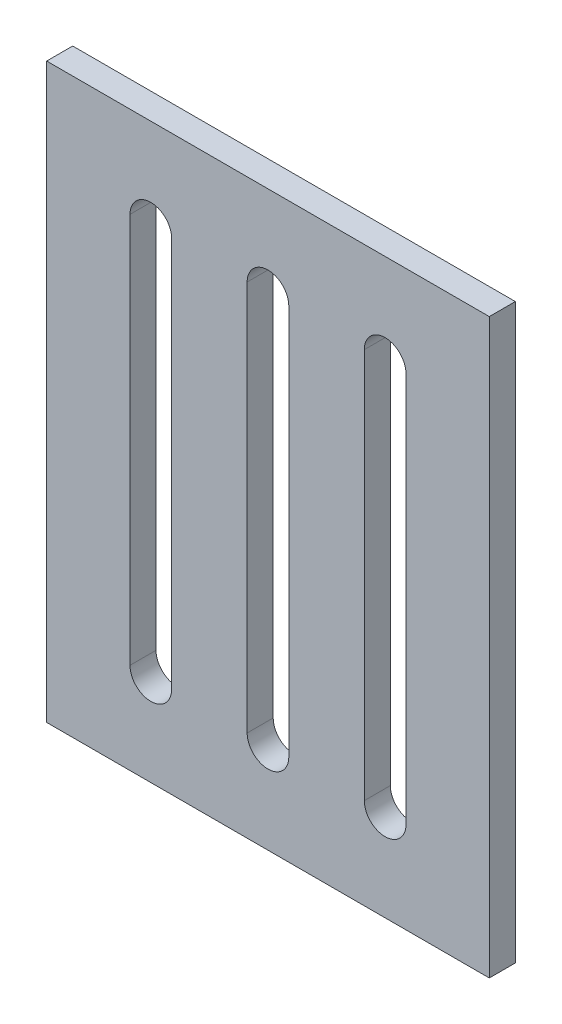
ISO-10303-21;
HEADER;
FILE_DESCRIPTION(('STEP AP214'),'2;1');
FILE_NAME('part.step','',(''),(''),'','','');
FILE_SCHEMA(('AUTOMOTIVE_DESIGN { 1 0 10303 214 1 1 1 1 }'));
ENDSEC;
DATA;
#1=APPLICATION_CONTEXT('core data for automotive mechanical design processes');
#2=APPLICATION_PROTOCOL_DEFINITION('international standard','automotive_design',2000,#1);
#3=PRODUCT_CONTEXT('',#1,'mechanical');
#4=PRODUCT('Part','Part','',(#3));
#5=PRODUCT_RELATED_PRODUCT_CATEGORY('part','',(#4));
#6=PRODUCT_DEFINITION_FORMATION('','',#4);
#7=PRODUCT_DEFINITION_CONTEXT('part definition',#1,'design');
#8=PRODUCT_DEFINITION('design','',#6,#7);
#9=PRODUCT_DEFINITION_SHAPE('','',#8);
#10=(LENGTH_UNIT() NAMED_UNIT(*) SI_UNIT(.MILLI.,.METRE.));
#11=(NAMED_UNIT(*) PLANE_ANGLE_UNIT() SI_UNIT($,.RADIAN.));
#12=(NAMED_UNIT(*) SI_UNIT($,.STERADIAN.) SOLID_ANGLE_UNIT());
#13=UNCERTAINTY_MEASURE_WITH_UNIT(LENGTH_MEASURE(1.E-05),#10,'distance_accuracy_value','');
#14=(GEOMETRIC_REPRESENTATION_CONTEXT(3) GLOBAL_UNCERTAINTY_ASSIGNED_CONTEXT((#13)) GLOBAL_UNIT_ASSIGNED_CONTEXT((#10,
#11,#12)) REPRESENTATION_CONTEXT('',''));
#15=CARTESIAN_POINT('',(0.,0.,0.));
#16=DIRECTION('',(0.,0.,1.));
#17=DIRECTION('',(1.,0.,0.));
#18=AXIS2_PLACEMENT_3D('',#15,#16,#17);
#19=CARTESIAN_POINT('',(0.,0.,5.));
#20=DIRECTION('',(0.,0.,1.));
#21=DIRECTION('',(1.,0.,0.));
#22=AXIS2_PLACEMENT_3D('',#19,#20,#21);
#23=PLANE('',#22);
#24=DIRECTION('',(0.,1.,0.));
#25=VECTOR('',#24,1.);
#26=CARTESIAN_POINT('',(85.,110.,5.));
#27=LINE('',#26,#25);
#28=CARTESIAN_POINT('',(85.,-110.,5.));
#29=VERTEX_POINT('',#28);
#30=CARTESIAN_POINT('',(85.,110.,5.));
#31=VERTEX_POINT('',#30);
#32=EDGE_CURVE('E291',#29,#31,#27,.T.);
#33=ORIENTED_EDGE('',*,*,#32,.T.);
#34=DIRECTION('',(-1.,0.,0.));
#35=VECTOR('',#34,1.);
#36=CARTESIAN_POINT('',(-85.,110.,5.));
#37=LINE('',#36,#35);
#38=CARTESIAN_POINT('',(-85.,110.,5.));
#39=VERTEX_POINT('',#38);
#40=EDGE_CURVE('E299',#31,#39,#37,.T.);
#41=ORIENTED_EDGE('',*,*,#40,.T.);
#42=DIRECTION('',(0.,-1.,0.));
#43=VECTOR('',#42,1.);
#44=CARTESIAN_POINT('',(-85.,110.,5.));
#45=LINE('',#44,#43);
#46=CARTESIAN_POINT('',(-85.,-110.,5.));
#47=VERTEX_POINT('',#46);
#48=EDGE_CURVE('E303',#39,#47,#45,.T.);
#49=ORIENTED_EDGE('',*,*,#48,.T.);
#50=DIRECTION('',(1.,0.,0.));
#51=VECTOR('',#50,1.);
#52=CARTESIAN_POINT('',(-85.,-110.,5.));
#53=LINE('',#52,#51);
#54=EDGE_CURVE('E305',#47,#29,#53,.T.);
#55=ORIENTED_EDGE('',*,*,#54,.T.);
#56=EDGE_LOOP('',(#33,#41,#49,#55));
#57=FACE_BOUND('',#56,.T.);
#58=DIRECTION('',(0.,-1.,0.));
#59=VECTOR('',#58,1.);
#60=CARTESIAN_POINT('',(-53.,75.,5.));
#61=LINE('',#60,#59);
#62=CARTESIAN_POINT('',(-53.,75.,5.));
#63=VERTEX_POINT('',#62);
#64=CARTESIAN_POINT('',(-53.,-75.,5.));
#65=VERTEX_POINT('',#64);
#66=EDGE_CURVE('E255',#63,#65,#61,.T.);
#67=ORIENTED_EDGE('',*,*,#66,.F.);
#68=CARTESIAN_POINT('',(-45.,75.,5.));
#69=DIRECTION('',(0.,0.,1.));
#70=DIRECTION('',(1.,0.,0.));
#71=AXIS2_PLACEMENT_3D('',#68,#69,#70);
#72=CIRCLE('',#71,8.);
#73=CARTESIAN_POINT('',(-37.,75.,5.));
#74=VERTEX_POINT('',#73);
#75=EDGE_CURVE('E248',#74,#63,#72,.T.);
#76=ORIENTED_EDGE('',*,*,#75,.F.);
#77=DIRECTION('',(0.,1.,0.));
#78=VECTOR('',#77,1.);
#79=CARTESIAN_POINT('',(-37.,75.,5.));
#80=LINE('',#79,#78);
#81=CARTESIAN_POINT('',(-37.,-75.,5.));
#82=VERTEX_POINT('',#81);
#83=EDGE_CURVE('E263',#82,#74,#80,.T.);
#84=ORIENTED_EDGE('',*,*,#83,.F.);
#85=CARTESIAN_POINT('',(-45.,-75.,5.));
#86=DIRECTION('',(0.,0.,1.));
#87=DIRECTION('',(1.,0.,0.));
#88=AXIS2_PLACEMENT_3D('',#85,#86,#87);
#89=CIRCLE('',#88,8.);
#90=EDGE_CURVE('E257',#65,#82,#89,.T.);
#91=ORIENTED_EDGE('',*,*,#90,.F.);
#92=EDGE_LOOP('',(#67,#76,#84,#91));
#93=FACE_BOUND('',#92,.T.);
#94=DIRECTION('',(0.,-1.,0.));
#95=VECTOR('',#94,1.);
#96=CARTESIAN_POINT('',(-7.99999999999998,75.,5.));
#97=LINE('',#96,#95);
#98=CARTESIAN_POINT('',(-7.99999999999998,75.,5.));
#99=VERTEX_POINT('',#98);
#100=CARTESIAN_POINT('',(-8.,-75.,5.));
#101=VERTEX_POINT('',#100);
#102=EDGE_CURVE('E208',#99,#101,#97,.T.);
#103=ORIENTED_EDGE('',*,*,#102,.F.);
#104=CARTESIAN_POINT('',(0.,75.,5.));
#105=DIRECTION('',(0.,0.,1.));
#106=DIRECTION('',(1.,0.,0.));
#107=AXIS2_PLACEMENT_3D('',#104,#105,#106);
#108=CIRCLE('',#107,8.);
#109=CARTESIAN_POINT('',(8.00000000000002,75.,5.));
#110=VERTEX_POINT('',#109);
#111=EDGE_CURVE('E209',#110,#99,#108,.T.);
#112=ORIENTED_EDGE('',*,*,#111,.F.);
#113=DIRECTION('',(0.,1.,0.));
#114=VECTOR('',#113,1.);
#115=CARTESIAN_POINT('',(8.00000000000002,75.,5.));
#116=LINE('',#115,#114);
#117=CARTESIAN_POINT('',(7.99999999999999,-75.,5.));
#118=VERTEX_POINT('',#117);
#119=EDGE_CURVE('E216',#118,#110,#116,.T.);
#120=ORIENTED_EDGE('',*,*,#119,.F.);
#121=CARTESIAN_POINT('',(0.,-75.,5.));
#122=DIRECTION('',(0.,0.,1.));
#123=DIRECTION('',(1.,0.,0.));
#124=AXIS2_PLACEMENT_3D('',#121,#122,#123);
#125=CIRCLE('',#124,8.);
#126=EDGE_CURVE('E215',#101,#118,#125,.T.);
#127=ORIENTED_EDGE('',*,*,#126,.F.);
#128=EDGE_LOOP('',(#103,#112,#120,#127));
#129=FACE_BOUND('',#128,.T.);
#130=DIRECTION('',(0.,-1.,0.));
#131=VECTOR('',#130,1.);
#132=CARTESIAN_POINT('',(37.,75.,5.));
#133=LINE('',#132,#131);
#134=CARTESIAN_POINT('',(37.,75.,5.));
#135=VERTEX_POINT('',#134);
#136=CARTESIAN_POINT('',(37.,-75.,5.));
#137=VERTEX_POINT('',#136);
#138=EDGE_CURVE('E166',#135,#137,#133,.T.);
#139=ORIENTED_EDGE('',*,*,#138,.F.);
#140=CARTESIAN_POINT('',(45.,75.,5.));
#141=DIRECTION('',(0.,0.,1.));
#142=DIRECTION('',(-1.,0.,0.));
#143=AXIS2_PLACEMENT_3D('',#140,#141,#142);
#144=CIRCLE('',#143,8.);
#145=CARTESIAN_POINT('',(53.,75.,5.));
#146=VERTEX_POINT('',#145);
#147=EDGE_CURVE('E159',#146,#135,#144,.T.);
#148=ORIENTED_EDGE('',*,*,#147,.F.);
#149=DIRECTION('',(0.,1.,0.));
#150=VECTOR('',#149,1.);
#151=CARTESIAN_POINT('',(53.,75.,5.));
#152=LINE('',#151,#150);
#153=CARTESIAN_POINT('',(53.,-75.,5.));
#154=VERTEX_POINT('',#153);
#155=EDGE_CURVE('E184',#154,#146,#152,.T.);
#156=ORIENTED_EDGE('',*,*,#155,.F.);
#157=CARTESIAN_POINT('',(45.,-75.,5.));
#158=DIRECTION('',(0.,0.,1.));
#159=DIRECTION('',(-1.,0.,0.));
#160=AXIS2_PLACEMENT_3D('',#157,#158,#159);
#161=CIRCLE('',#160,8.);
#162=EDGE_CURVE('E181',#137,#154,#161,.T.);
#163=ORIENTED_EDGE('',*,*,#162,.F.);
#164=EDGE_LOOP('',(#139,#148,#156,#163));
#165=FACE_BOUND('',#164,.T.);
#166=ADVANCED_FACE('F44',(#57,#93,#129,#165),#23,.T.);
#167=CARTESIAN_POINT('',(0.,0.,-5.));
#168=DIRECTION('',(0.,0.,1.));
#169=DIRECTION('',(1.,0.,0.));
#170=AXIS2_PLACEMENT_3D('',#167,#168,#169);
#171=PLANE('',#170);
#172=CARTESIAN_POINT('',(0.,75.,-5.));
#173=DIRECTION('',(0.,0.,1.));
#174=DIRECTION('',(1.,0.,0.));
#175=AXIS2_PLACEMENT_3D('',#172,#173,#174);
#176=CIRCLE('',#175,8.);
#177=CARTESIAN_POINT('',(8.00000000000002,75.,-5.));
#178=VERTEX_POINT('',#177);
#179=CARTESIAN_POINT('',(-7.99999999999998,75.,-5.));
#180=VERTEX_POINT('',#179);
#181=EDGE_CURVE('E180',#178,#180,#176,.T.);
#182=ORIENTED_EDGE('',*,*,#181,.T.);
#183=DIRECTION('',(0.,-1.,0.));
#184=VECTOR('',#183,1.);
#185=CARTESIAN_POINT('',(-7.99999999999998,75.,-5.));
#186=LINE('',#185,#184);
#187=CARTESIAN_POINT('',(-8.,-75.,-5.));
#188=VERTEX_POINT('',#187);
#189=EDGE_CURVE('E224',#180,#188,#186,.T.);
#190=ORIENTED_EDGE('',*,*,#189,.T.);
#191=CARTESIAN_POINT('',(0.,-75.,-5.));
#192=DIRECTION('',(0.,0.,1.));
#193=DIRECTION('',(1.,0.,0.));
#194=AXIS2_PLACEMENT_3D('',#191,#192,#193);
#195=CIRCLE('',#194,8.);
#196=CARTESIAN_POINT('',(7.99999999999999,-75.,-5.));
#197=VERTEX_POINT('',#196);
#198=EDGE_CURVE('E227',#188,#197,#195,.T.);
#199=ORIENTED_EDGE('',*,*,#198,.T.);
#200=DIRECTION('',(0.,1.,0.));
#201=VECTOR('',#200,1.);
#202=CARTESIAN_POINT('',(8.00000000000002,75.,-5.));
#203=LINE('',#202,#201);
#204=EDGE_CURVE('E213',#197,#178,#203,.T.);
#205=ORIENTED_EDGE('',*,*,#204,.T.);
#206=EDGE_LOOP('',(#182,#190,#199,#205));
#207=FACE_BOUND('',#206,.T.);
#208=DIRECTION('',(0.,1.,0.));
#209=VECTOR('',#208,1.);
#210=CARTESIAN_POINT('',(85.,110.,-5.));
#211=LINE('',#210,#209);
#212=CARTESIAN_POINT('',(85.,-110.,-5.));
#213=VERTEX_POINT('',#212);
#214=CARTESIAN_POINT('',(85.,110.,-5.));
#215=VERTEX_POINT('',#214);
#216=EDGE_CURVE('E295',#213,#215,#211,.T.);
#217=ORIENTED_EDGE('',*,*,#216,.F.);
#218=DIRECTION('',(1.,0.,0.));
#219=VECTOR('',#218,1.);
#220=CARTESIAN_POINT('',(-85.,-110.,-5.));
#221=LINE('',#220,#219);
#222=CARTESIAN_POINT('',(-85.,-110.,-5.));
#223=VERTEX_POINT('',#222);
#224=EDGE_CURVE('E300',#223,#213,#221,.T.);
#225=ORIENTED_EDGE('',*,*,#224,.F.);
#226=DIRECTION('',(0.,-1.,0.));
#227=VECTOR('',#226,1.);
#228=CARTESIAN_POINT('',(-85.,110.,-5.));
#229=LINE('',#228,#227);
#230=CARTESIAN_POINT('',(-85.,110.,-5.));
#231=VERTEX_POINT('',#230);
#232=EDGE_CURVE('E312',#231,#223,#229,.T.);
#233=ORIENTED_EDGE('',*,*,#232,.F.);
#234=DIRECTION('',(-1.,0.,0.));
#235=VECTOR('',#234,1.);
#236=CARTESIAN_POINT('',(-85.,110.,-5.));
#237=LINE('',#236,#235);
#238=EDGE_CURVE('E311',#215,#231,#237,.T.);
#239=ORIENTED_EDGE('',*,*,#238,.F.);
#240=EDGE_LOOP('',(#217,#225,#233,#239));
#241=FACE_BOUND('',#240,.T.);
#242=CARTESIAN_POINT('',(-45.,75.,-5.));
#243=DIRECTION('',(0.,0.,1.));
#244=DIRECTION('',(1.,0.,0.));
#245=AXIS2_PLACEMENT_3D('',#242,#243,#244);
#246=CIRCLE('',#245,8.);
#247=CARTESIAN_POINT('',(-37.,75.,-5.));
#248=VERTEX_POINT('',#247);
#249=CARTESIAN_POINT('',(-53.,75.,-5.));
#250=VERTEX_POINT('',#249);
#251=EDGE_CURVE('E249',#248,#250,#246,.T.);
#252=ORIENTED_EDGE('',*,*,#251,.T.);
#253=DIRECTION('',(0.,-1.,0.));
#254=VECTOR('',#253,1.);
#255=CARTESIAN_POINT('',(-53.,75.,-5.));
#256=LINE('',#255,#254);
#257=CARTESIAN_POINT('',(-53.,-75.,-5.));
#258=VERTEX_POINT('',#257);
#259=EDGE_CURVE('E268',#250,#258,#256,.T.);
#260=ORIENTED_EDGE('',*,*,#259,.T.);
#261=CARTESIAN_POINT('',(-45.,-75.,-5.));
#262=DIRECTION('',(0.,0.,1.));
#263=DIRECTION('',(1.,0.,0.));
#264=AXIS2_PLACEMENT_3D('',#261,#262,#263);
#265=CIRCLE('',#264,8.);
#266=CARTESIAN_POINT('',(-37.,-75.,-5.));
#267=VERTEX_POINT('',#266);
#268=EDGE_CURVE('E275',#258,#267,#265,.T.);
#269=ORIENTED_EDGE('',*,*,#268,.T.);
#270=DIRECTION('',(0.,1.,0.));
#271=VECTOR('',#270,1.);
#272=CARTESIAN_POINT('',(-37.,75.,-5.));
#273=LINE('',#272,#271);
#274=EDGE_CURVE('E251',#267,#248,#273,.T.);
#275=ORIENTED_EDGE('',*,*,#274,.T.);
#276=EDGE_LOOP('',(#252,#260,#269,#275));
#277=FACE_BOUND('',#276,.T.);
#278=CARTESIAN_POINT('',(45.,75.,-5.));
#279=DIRECTION('',(0.,0.,1.));
#280=DIRECTION('',(-1.,0.,0.));
#281=AXIS2_PLACEMENT_3D('',#278,#279,#280);
#282=CIRCLE('',#281,8.);
#283=CARTESIAN_POINT('',(53.,75.,-5.));
#284=VERTEX_POINT('',#283);
#285=CARTESIAN_POINT('',(37.,75.,-5.));
#286=VERTEX_POINT('',#285);
#287=EDGE_CURVE('E69',#284,#286,#282,.T.);
#288=ORIENTED_EDGE('',*,*,#287,.T.);
#289=DIRECTION('',(0.,-1.,0.));
#290=VECTOR('',#289,1.);
#291=CARTESIAN_POINT('',(37.,75.,-5.));
#292=LINE('',#291,#290);
#293=CARTESIAN_POINT('',(37.,-75.,-5.));
#294=VERTEX_POINT('',#293);
#295=EDGE_CURVE('E172',#286,#294,#292,.T.);
#296=ORIENTED_EDGE('',*,*,#295,.T.);
#297=CARTESIAN_POINT('',(45.,-75.,-5.));
#298=DIRECTION('',(0.,0.,1.));
#299=DIRECTION('',(-1.,0.,0.));
#300=AXIS2_PLACEMENT_3D('',#297,#298,#299);
#301=CIRCLE('',#300,8.);
#302=CARTESIAN_POINT('',(53.,-75.,-5.));
#303=VERTEX_POINT('',#302);
#304=EDGE_CURVE('E191',#294,#303,#301,.T.);
#305=ORIENTED_EDGE('',*,*,#304,.T.);
#306=DIRECTION('',(0.,1.,0.));
#307=VECTOR('',#306,1.);
#308=CARTESIAN_POINT('',(53.,75.,-5.));
#309=LINE('',#308,#307);
#310=EDGE_CURVE('E170',#303,#284,#309,.T.);
#311=ORIENTED_EDGE('',*,*,#310,.T.);
#312=EDGE_LOOP('',(#288,#296,#305,#311));
#313=FACE_BOUND('',#312,.T.);
#314=ADVANCED_FACE('F340',(#207,#241,#277,#313),#171,.F.);
#315=CARTESIAN_POINT('',(85.,110.,5.));
#316=DIRECTION('',(-1.,0.,0.));
#317=DIRECTION('',(0.,-1.,0.));
#318=AXIS2_PLACEMENT_3D('',#315,#316,#317);
#319=PLANE('',#318);
#320=ORIENTED_EDGE('',*,*,#216,.T.);
#321=DIRECTION('',(0.,0.,-1.));
#322=VECTOR('',#321,1.);
#323=CARTESIAN_POINT('',(85.,110.,5.));
#324=LINE('',#323,#322);
#325=EDGE_CURVE('E11',#31,#215,#324,.T.);
#326=ORIENTED_EDGE('',*,*,#325,.F.);
#327=ORIENTED_EDGE('',*,*,#32,.F.);
#328=DIRECTION('',(0.,0.,-1.));
#329=VECTOR('',#328,1.);
#330=CARTESIAN_POINT('',(85.,-110.,5.));
#331=LINE('',#330,#329);
#332=EDGE_CURVE('E310',#29,#213,#331,.T.);
#333=ORIENTED_EDGE('',*,*,#332,.T.);
#334=EDGE_LOOP('',(#320,#326,#327,#333));
#335=FACE_BOUND('',#334,.T.);
#336=ADVANCED_FACE('F50',(#335),#319,.F.);
#337=CARTESIAN_POINT('',(-85.,110.,5.));
#338=DIRECTION('',(0.,-1.,0.));
#339=DIRECTION('',(0.,0.,-1.));
#340=AXIS2_PLACEMENT_3D('',#337,#338,#339);
#341=PLANE('',#340);
#342=ORIENTED_EDGE('',*,*,#238,.T.);
#343=DIRECTION('',(0.,0.,-1.));
#344=VECTOR('',#343,1.);
#345=CARTESIAN_POINT('',(-85.,110.,5.));
#346=LINE('',#345,#344);
#347=EDGE_CURVE('E53',#39,#231,#346,.T.);
#348=ORIENTED_EDGE('',*,*,#347,.F.);
#349=ORIENTED_EDGE('',*,*,#40,.F.);
#350=ORIENTED_EDGE('',*,*,#325,.T.);
#351=EDGE_LOOP('',(#342,#348,#349,#350));
#352=FACE_BOUND('',#351,.T.);
#353=ADVANCED_FACE('F346',(#352),#341,.F.);
#354=CARTESIAN_POINT('',(-85.,110.,5.));
#355=DIRECTION('',(1.,0.,0.));
#356=DIRECTION('',(0.,1.,0.));
#357=AXIS2_PLACEMENT_3D('',#354,#355,#356);
#358=PLANE('',#357);
#359=ORIENTED_EDGE('',*,*,#232,.T.);
#360=DIRECTION('',(0.,0.,-1.));
#361=VECTOR('',#360,1.);
#362=CARTESIAN_POINT('',(-85.,-110.,5.));
#363=LINE('',#362,#361);
#364=EDGE_CURVE('E325',#47,#223,#363,.T.);
#365=ORIENTED_EDGE('',*,*,#364,.F.);
#366=ORIENTED_EDGE('',*,*,#48,.F.);
#367=ORIENTED_EDGE('',*,*,#347,.T.);
#368=EDGE_LOOP('',(#359,#365,#366,#367));
#369=FACE_BOUND('',#368,.T.);
#370=ADVANCED_FACE('F332',(#369),#358,.F.);
#371=CARTESIAN_POINT('',(-85.,-110.,5.));
#372=DIRECTION('',(0.,1.,0.));
#373=DIRECTION('',(0.,0.,1.));
#374=AXIS2_PLACEMENT_3D('',#371,#372,#373);
#375=PLANE('',#374);
#376=ORIENTED_EDGE('',*,*,#224,.T.);
#377=ORIENTED_EDGE('',*,*,#332,.F.);
#378=ORIENTED_EDGE('',*,*,#54,.F.);
#379=ORIENTED_EDGE('',*,*,#364,.T.);
#380=EDGE_LOOP('',(#376,#377,#378,#379));
#381=FACE_BOUND('',#380,.T.);
#382=ADVANCED_FACE('F342',(#381),#375,.F.);
#383=CARTESIAN_POINT('',(-45.,75.,5.));
#384=DIRECTION('',(0.,0.,-1.));
#385=DIRECTION('',(-1.,0.,0.));
#386=AXIS2_PLACEMENT_3D('',#383,#384,#385);
#387=CYLINDRICAL_SURFACE('',#386,8.);
#388=ORIENTED_EDGE('',*,*,#251,.F.);
#389=DIRECTION('',(0.,0.,-1.));
#390=VECTOR('',#389,1.);
#391=CARTESIAN_POINT('',(-37.,75.,5.));
#392=LINE('',#391,#390);
#393=EDGE_CURVE('E264',#74,#248,#392,.T.);
#394=ORIENTED_EDGE('',*,*,#393,.F.);
#395=ORIENTED_EDGE('',*,*,#75,.T.);
#396=DIRECTION('',(0.,0.,-1.));
#397=VECTOR('',#396,1.);
#398=CARTESIAN_POINT('',(-53.,75.,5.));
#399=LINE('',#398,#397);
#400=EDGE_CURVE('E290',#63,#250,#399,.T.);
#401=ORIENTED_EDGE('',*,*,#400,.T.);
#402=EDGE_LOOP('',(#388,#394,#395,#401));
#403=FACE_BOUND('',#402,.T.);
#404=ADVANCED_FACE('F363',(#403),#387,.F.);
#405=CARTESIAN_POINT('',(-53.,75.,5.));
#406=DIRECTION('',(1.,0.,0.));
#407=DIRECTION('',(0.,0.,-1.));
#408=AXIS2_PLACEMENT_3D('',#405,#406,#407);
#409=PLANE('',#408);
#410=ORIENTED_EDGE('',*,*,#259,.F.);
#411=ORIENTED_EDGE('',*,*,#400,.F.);
#412=ORIENTED_EDGE('',*,*,#66,.T.);
#413=DIRECTION('',(0.,0.,-1.));
#414=VECTOR('',#413,1.);
#415=CARTESIAN_POINT('',(-53.,-75.,5.));
#416=LINE('',#415,#414);
#417=EDGE_CURVE('E283',#65,#258,#416,.T.);
#418=ORIENTED_EDGE('',*,*,#417,.T.);
#419=EDGE_LOOP('',(#410,#411,#412,#418));
#420=FACE_BOUND('',#419,.T.);
#421=ADVANCED_FACE('F369',(#420),#409,.T.);
#422=CARTESIAN_POINT('',(-45.,-75.,5.));
#423=DIRECTION('',(0.,0.,-1.));
#424=DIRECTION('',(-1.,0.,0.));
#425=AXIS2_PLACEMENT_3D('',#422,#423,#424);
#426=CYLINDRICAL_SURFACE('',#425,8.);
#427=ORIENTED_EDGE('',*,*,#268,.F.);
#428=ORIENTED_EDGE('',*,*,#417,.F.);
#429=ORIENTED_EDGE('',*,*,#90,.T.);
#430=DIRECTION('',(0.,0.,-1.));
#431=VECTOR('',#430,1.);
#432=CARTESIAN_POINT('',(-37.,-75.,5.));
#433=LINE('',#432,#431);
#434=EDGE_CURVE('E285',#82,#267,#433,.T.);
#435=ORIENTED_EDGE('',*,*,#434,.T.);
#436=EDGE_LOOP('',(#427,#428,#429,#435));
#437=FACE_BOUND('',#436,.T.);
#438=ADVANCED_FACE('F373',(#437),#426,.F.);
#439=CARTESIAN_POINT('',(-37.,75.,5.));
#440=DIRECTION('',(-1.,0.,0.));
#441=DIRECTION('',(0.,0.,1.));
#442=AXIS2_PLACEMENT_3D('',#439,#440,#441);
#443=PLANE('',#442);
#444=ORIENTED_EDGE('',*,*,#274,.F.);
#445=ORIENTED_EDGE('',*,*,#434,.F.);
#446=ORIENTED_EDGE('',*,*,#83,.T.);
#447=ORIENTED_EDGE('',*,*,#393,.T.);
#448=EDGE_LOOP('',(#444,#445,#446,#447));
#449=FACE_BOUND('',#448,.T.);
#450=ADVANCED_FACE('F385',(#449),#443,.T.);
#451=CARTESIAN_POINT('',(0.,75.,5.));
#452=DIRECTION('',(0.,0.,-1.));
#453=DIRECTION('',(-1.,0.,0.));
#454=AXIS2_PLACEMENT_3D('',#451,#452,#453);
#455=CYLINDRICAL_SURFACE('',#454,8.);
#456=ORIENTED_EDGE('',*,*,#181,.F.);
#457=DIRECTION('',(0.,0.,-1.));
#458=VECTOR('',#457,1.);
#459=CARTESIAN_POINT('',(8.00000000000002,75.,5.));
#460=LINE('',#459,#458);
#461=EDGE_CURVE('E221',#110,#178,#460,.T.);
#462=ORIENTED_EDGE('',*,*,#461,.F.);
#463=ORIENTED_EDGE('',*,*,#111,.T.);
#464=DIRECTION('',(0.,0.,-1.));
#465=VECTOR('',#464,1.);
#466=CARTESIAN_POINT('',(-7.99999999999998,75.,5.));
#467=LINE('',#466,#465);
#468=EDGE_CURVE('E243',#99,#180,#467,.T.);
#469=ORIENTED_EDGE('',*,*,#468,.T.);
#470=EDGE_LOOP('',(#456,#462,#463,#469));
#471=FACE_BOUND('',#470,.T.);
#472=ADVANCED_FACE('F402',(#471),#455,.F.);
#473=CARTESIAN_POINT('',(-7.99999999999998,75.,5.));
#474=DIRECTION('',(1.,0.,0.));
#475=DIRECTION('',(0.,1.,0.));
#476=AXIS2_PLACEMENT_3D('',#473,#474,#475);
#477=PLANE('',#476);
#478=ORIENTED_EDGE('',*,*,#189,.F.);
#479=ORIENTED_EDGE('',*,*,#468,.F.);
#480=ORIENTED_EDGE('',*,*,#102,.T.);
#481=DIRECTION('',(0.,0.,-1.));
#482=VECTOR('',#481,1.);
#483=CARTESIAN_POINT('',(-8.,-75.,5.));
#484=LINE('',#483,#482);
#485=EDGE_CURVE('E244',#101,#188,#484,.T.);
#486=ORIENTED_EDGE('',*,*,#485,.T.);
#487=EDGE_LOOP('',(#478,#479,#480,#486));
#488=FACE_BOUND('',#487,.T.);
#489=ADVANCED_FACE('F396',(#488),#477,.T.);
#490=CARTESIAN_POINT('',(0.,-75.,5.));
#491=DIRECTION('',(0.,0.,-1.));
#492=DIRECTION('',(-1.,0.,0.));
#493=AXIS2_PLACEMENT_3D('',#490,#491,#492);
#494=CYLINDRICAL_SURFACE('',#493,8.);
#495=ORIENTED_EDGE('',*,*,#198,.F.);
#496=ORIENTED_EDGE('',*,*,#485,.F.);
#497=ORIENTED_EDGE('',*,*,#126,.T.);
#498=DIRECTION('',(0.,0.,-1.));
#499=VECTOR('',#498,1.);
#500=CARTESIAN_POINT('',(7.99999999999999,-75.,5.));
#501=LINE('',#500,#499);
#502=EDGE_CURVE('E236',#118,#197,#501,.T.);
#503=ORIENTED_EDGE('',*,*,#502,.T.);
#504=EDGE_LOOP('',(#495,#496,#497,#503));
#505=FACE_BOUND('',#504,.T.);
#506=ADVANCED_FACE('F401',(#505),#494,.F.);
#507=CARTESIAN_POINT('',(8.00000000000002,75.,5.));
#508=DIRECTION('',(-1.,0.,0.));
#509=DIRECTION('',(0.,-1.,0.));
#510=AXIS2_PLACEMENT_3D('',#507,#508,#509);
#511=PLANE('',#510);
#512=ORIENTED_EDGE('',*,*,#204,.F.);
#513=ORIENTED_EDGE('',*,*,#502,.F.);
#514=ORIENTED_EDGE('',*,*,#119,.T.);
#515=ORIENTED_EDGE('',*,*,#461,.T.);
#516=EDGE_LOOP('',(#512,#513,#514,#515));
#517=FACE_BOUND('',#516,.T.);
#518=ADVANCED_FACE('F410',(#517),#511,.T.);
#519=CARTESIAN_POINT('',(45.,75.,5.));
#520=DIRECTION('',(0.,0.,-1.));
#521=DIRECTION('',(-1.,0.,0.));
#522=AXIS2_PLACEMENT_3D('',#519,#520,#521);
#523=CYLINDRICAL_SURFACE('',#522,8.);
#524=ORIENTED_EDGE('',*,*,#287,.F.);
#525=DIRECTION('',(0.,0.,-1.));
#526=VECTOR('',#525,1.);
#527=CARTESIAN_POINT('',(53.,75.,5.));
#528=LINE('',#527,#526);
#529=EDGE_CURVE('E165',#146,#284,#528,.T.);
#530=ORIENTED_EDGE('',*,*,#529,.F.);
#531=ORIENTED_EDGE('',*,*,#147,.T.);
#532=DIRECTION('',(0.,0.,-1.));
#533=VECTOR('',#532,1.);
#534=CARTESIAN_POINT('',(37.,75.,5.));
#535=LINE('',#534,#533);
#536=EDGE_CURVE('E164',#135,#286,#535,.T.);
#537=ORIENTED_EDGE('',*,*,#536,.T.);
#538=EDGE_LOOP('',(#524,#530,#531,#537));
#539=FACE_BOUND('',#538,.T.);
#540=ADVANCED_FACE('F162',(#539),#523,.F.);
#541=CARTESIAN_POINT('',(37.,75.,5.));
#542=DIRECTION('',(1.,0.,0.));
#543=DIRECTION('',(0.,1.,0.));
#544=AXIS2_PLACEMENT_3D('',#541,#542,#543);
#545=PLANE('',#544);
#546=ORIENTED_EDGE('',*,*,#295,.F.);
#547=ORIENTED_EDGE('',*,*,#536,.F.);
#548=ORIENTED_EDGE('',*,*,#138,.T.);
#549=DIRECTION('',(0.,0.,-1.));
#550=VECTOR('',#549,1.);
#551=CARTESIAN_POINT('',(37.,-75.,5.));
#552=LINE('',#551,#550);
#553=EDGE_CURVE('E178',#137,#294,#552,.T.);
#554=ORIENTED_EDGE('',*,*,#553,.T.);
#555=EDGE_LOOP('',(#546,#547,#548,#554));
#556=FACE_BOUND('',#555,.T.);
#557=ADVANCED_FACE('F175',(#556),#545,.T.);
#558=CARTESIAN_POINT('',(45.,-75.,5.));
#559=DIRECTION('',(0.,0.,-1.));
#560=DIRECTION('',(-1.,0.,0.));
#561=AXIS2_PLACEMENT_3D('',#558,#559,#560);
#562=CYLINDRICAL_SURFACE('',#561,8.);
#563=ORIENTED_EDGE('',*,*,#304,.F.);
#564=ORIENTED_EDGE('',*,*,#553,.F.);
#565=ORIENTED_EDGE('',*,*,#162,.T.);
#566=DIRECTION('',(0.,0.,-1.));
#567=VECTOR('',#566,1.);
#568=CARTESIAN_POINT('',(53.,-75.,5.));
#569=LINE('',#568,#567);
#570=EDGE_CURVE('E62',#154,#303,#569,.T.);
#571=ORIENTED_EDGE('',*,*,#570,.T.);
#572=EDGE_LOOP('',(#563,#564,#565,#571));
#573=FACE_BOUND('',#572,.T.);
#574=ADVANCED_FACE('F466',(#573),#562,.F.);
#575=CARTESIAN_POINT('',(53.,75.,5.));
#576=DIRECTION('',(-1.,0.,0.));
#577=DIRECTION('',(0.,-1.,0.));
#578=AXIS2_PLACEMENT_3D('',#575,#576,#577);
#579=PLANE('',#578);
#580=ORIENTED_EDGE('',*,*,#310,.F.);
#581=ORIENTED_EDGE('',*,*,#570,.F.);
#582=ORIENTED_EDGE('',*,*,#155,.T.);
#583=ORIENTED_EDGE('',*,*,#529,.T.);
#584=EDGE_LOOP('',(#580,#581,#582,#583));
#585=FACE_BOUND('',#584,.T.);
#586=ADVANCED_FACE('F479',(#585),#579,.T.);
#587=CLOSED_SHELL('',(#166,#314,#336,#353,#370,#382,#404,#421,#438,#450,#472,#489,#506,#518,
#540,#557,#574,#586));
#588=MANIFOLD_SOLID_BREP('B2',#587);
#589=ADVANCED_BREP_SHAPE_REPRESENTATION('',(#18,#588),#14);
#590=SHAPE_DEFINITION_REPRESENTATION(#9,#589);
ENDSEC;
END-ISO-10303-21;
